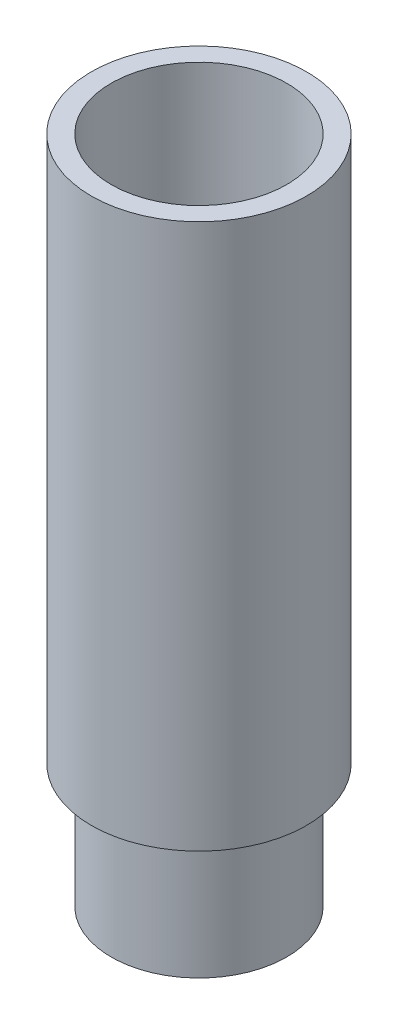
ISO-10303-21;
HEADER;
FILE_DESCRIPTION(('STEP AP214'),'2;1');
FILE_NAME('part.step','',(''),(''),'','','');
FILE_SCHEMA(('AUTOMOTIVE_DESIGN { 1 0 10303 214 1 1 1 1 }'));
ENDSEC;
DATA;
#1=APPLICATION_CONTEXT('core data for automotive mechanical design processes');
#2=APPLICATION_PROTOCOL_DEFINITION('international standard','automotive_design',2000,#1);
#3=PRODUCT_CONTEXT('',#1,'mechanical');
#4=PRODUCT('Part','Part','',(#3));
#5=PRODUCT_RELATED_PRODUCT_CATEGORY('part','',(#4));
#6=PRODUCT_DEFINITION_FORMATION('','',#4);
#7=PRODUCT_DEFINITION_CONTEXT('part definition',#1,'design');
#8=PRODUCT_DEFINITION('design','',#6,#7);
#9=PRODUCT_DEFINITION_SHAPE('','',#8);
#10=(LENGTH_UNIT() NAMED_UNIT(*) SI_UNIT(.MILLI.,.METRE.));
#11=(NAMED_UNIT(*) PLANE_ANGLE_UNIT() SI_UNIT($,.RADIAN.));
#12=(NAMED_UNIT(*) SI_UNIT($,.STERADIAN.) SOLID_ANGLE_UNIT());
#13=UNCERTAINTY_MEASURE_WITH_UNIT(LENGTH_MEASURE(1.E-05),#10,'distance_accuracy_value','');
#14=(GEOMETRIC_REPRESENTATION_CONTEXT(3) GLOBAL_UNCERTAINTY_ASSIGNED_CONTEXT((#13)) GLOBAL_UNIT_ASSIGNED_CONTEXT((#10,
#11,#12)) REPRESENTATION_CONTEXT('',''));
#15=CARTESIAN_POINT('',(0.,0.,0.));
#16=DIRECTION('',(0.,0.,1.));
#17=DIRECTION('',(1.,0.,0.));
#18=AXIS2_PLACEMENT_3D('',#15,#16,#17);
#19=CARTESIAN_POINT('',(0.,19.05,0.));
#20=DIRECTION('',(0.,-1.,0.));
#21=DIRECTION('',(0.,0.,-1.));
#22=AXIS2_PLACEMENT_3D('',#19,#20,#21);
#23=CYLINDRICAL_SURFACE('',#22,6.9723);
#24=CARTESIAN_POINT('',(0.,19.05,0.));
#25=DIRECTION('',(0.,1.,0.));
#26=DIRECTION('',(0.,0.,1.));
#27=AXIS2_PLACEMENT_3D('',#24,#25,#26);
#28=CIRCLE('',#27,6.9723);
#29=CARTESIAN_POINT('',(0.,19.05,6.9723));
#30=VERTEX_POINT('',#29);
#31=EDGE_CURVE('E97',#30,#30,#28,.T.);
#32=ORIENTED_EDGE('',*,*,#31,.T.);
#33=EDGE_LOOP('',(#32));
#34=FACE_BOUND('',#33,.T.);
#35=CARTESIAN_POINT('',(0.,0.,0.));
#36=DIRECTION('',(0.,1.,0.));
#37=DIRECTION('',(0.,0.,1.));
#38=AXIS2_PLACEMENT_3D('',#35,#36,#37);
#39=CIRCLE('',#38,6.9723);
#40=CARTESIAN_POINT('',(2.54,0.,6.49317851980061));
#41=VERTEX_POINT('',#40);
#42=CARTESIAN_POINT('',(2.54,0.,-6.49317851980061));
#43=VERTEX_POINT('',#42);
#44=EDGE_CURVE('E93',#41,#43,#39,.T.);
#45=ORIENTED_EDGE('',*,*,#44,.F.);
#46=DIRECTION('',(0.,-1.,0.));
#47=VECTOR('',#46,1.);
#48=CARTESIAN_POINT('',(2.54,19.05,6.49317851980061));
#49=LINE('',#48,#47);
#50=CARTESIAN_POINT('',(2.54,2.54,6.49317851980061));
#51=VERTEX_POINT('',#50);
#52=EDGE_CURVE('E155',#51,#41,#49,.T.);
#53=ORIENTED_EDGE('',*,*,#52,.F.);
#54=CARTESIAN_POINT('',(0.,2.54,0.));
#55=DIRECTION('',(0.,-1.,0.));
#56=DIRECTION('',(0.,0.,-1.));
#57=AXIS2_PLACEMENT_3D('',#54,#55,#56);
#58=CIRCLE('',#57,6.9723);
#59=CARTESIAN_POINT('',(0.,2.54,6.9723));
#60=VERTEX_POINT('',#59);
#61=EDGE_CURVE('E81',#60,#51,#58,.F.);
#62=ORIENTED_EDGE('',*,*,#61,.F.);
#63=DIRECTION('',(0.,-1.,0.));
#64=VECTOR('',#63,1.);
#65=CARTESIAN_POINT('',(0.,19.05,6.9723));
#66=LINE('',#65,#64);
#67=CARTESIAN_POINT('',(0.,0.,6.9723));
#68=VERTEX_POINT('',#67);
#69=EDGE_CURVE('E92',#68,#60,#66,.F.);
#70=ORIENTED_EDGE('',*,*,#69,.F.);
#71=CARTESIAN_POINT('',(0.,0.,-6.9723));
#72=VERTEX_POINT('',#71);
#73=EDGE_CURVE('E80',#72,#68,#39,.T.);
#74=ORIENTED_EDGE('',*,*,#73,.F.);
#75=DIRECTION('',(0.,-1.,0.));
#76=VECTOR('',#75,1.);
#77=CARTESIAN_POINT('',(0.,19.05,-6.9723));
#78=LINE('',#77,#76);
#79=CARTESIAN_POINT('',(0.,2.54,-6.9723));
#80=VERTEX_POINT('',#79);
#81=EDGE_CURVE('E85',#72,#80,#78,.F.);
#82=ORIENTED_EDGE('',*,*,#81,.T.);
#83=CARTESIAN_POINT('',(0.,2.54,0.));
#84=DIRECTION('',(0.,1.,0.));
#85=DIRECTION('',(0.,0.,1.));
#86=AXIS2_PLACEMENT_3D('',#83,#84,#85);
#87=CIRCLE('',#86,6.9723);
#88=CARTESIAN_POINT('',(2.54,2.54,-6.49317851980061));
#89=VERTEX_POINT('',#88);
#90=EDGE_CURVE('E52',#80,#89,#87,.F.);
#91=ORIENTED_EDGE('',*,*,#90,.T.);
#92=DIRECTION('',(0.,-1.,0.));
#93=VECTOR('',#92,1.);
#94=CARTESIAN_POINT('',(2.54,19.05,-6.49317851980061));
#95=LINE('',#94,#93);
#96=EDGE_CURVE('E152',#89,#43,#95,.T.);
#97=ORIENTED_EDGE('',*,*,#96,.T.);
#98=EDGE_LOOP('',(#45,#53,#62,#70,#74,#82,#91,#97));
#99=FACE_BOUND('',#98,.T.);
#100=ADVANCED_FACE('F37',(#34,#99),#23,.F.);
#101=CARTESIAN_POINT('',(0.,19.05,0.));
#102=DIRECTION('',(0.,-1.,0.));
#103=DIRECTION('',(0.,0.,-1.));
#104=AXIS2_PLACEMENT_3D('',#101,#102,#103);
#105=CYLINDRICAL_SURFACE('',#104,9.0043);
#106=CARTESIAN_POINT('',(0.,0.,0.));
#107=DIRECTION('',(0.,1.,0.));
#108=DIRECTION('',(0.,0.,1.));
#109=AXIS2_PLACEMENT_3D('',#106,#107,#108);
#110=CIRCLE('',#109,9.0043);
#111=CARTESIAN_POINT('',(0.,0.,-9.0043));
#112=VERTEX_POINT('',#111);
#113=EDGE_CURVE('E45',#112,#112,#110,.T.);
#114=CARTESIAN_POINT('',(0.,12.7,0.));
#115=DIRECTION('',(0.,1.,0.));
#116=DIRECTION('',(0.,0.,1.));
#117=AXIS2_PLACEMENT_3D('',#114,#115,#116);
#118=CIRCLE('',#117,9.0043);
#119=CARTESIAN_POINT('',(0.,12.7,-9.0043));
#120=VERTEX_POINT('',#119);
#121=EDGE_CURVE('E11',#120,#120,#118,.T.);
#122=CARTESIAN_POINT('',(0.,0.,-9.0043));
#123=CARTESIAN_POINT('',(0.,0.132291666666667,-9.0043));
#124=CARTESIAN_POINT('',(0.,0.264583333333334,-9.0043));
#125=CARTESIAN_POINT('',(0.,0.529166666666667,-9.0043));
#126=CARTESIAN_POINT('',(0.,0.661458333333333,-9.0043));
#127=CARTESIAN_POINT('',(0.,0.926041666666666,-9.0043));
#128=CARTESIAN_POINT('',(0.,1.05833333333333,-9.0043));
#129=CARTESIAN_POINT('',(0.,1.32291666666667,-9.0043));
#130=CARTESIAN_POINT('',(0.,1.45520833333333,-9.0043));
#131=CARTESIAN_POINT('',(0.,1.71979166666667,-9.0043));
#132=CARTESIAN_POINT('',(0.,1.85208333333333,-9.0043));
#133=CARTESIAN_POINT('',(0.,2.11666666666667,-9.0043));
#134=CARTESIAN_POINT('',(0.,2.24895833333333,-9.0043));
#135=CARTESIAN_POINT('',(0.,2.51354166666667,-9.0043));
#136=CARTESIAN_POINT('',(0.,2.64583333333333,-9.0043));
#137=CARTESIAN_POINT('',(0.,2.91041666666667,-9.0043));
#138=CARTESIAN_POINT('',(0.,3.04270833333333,-9.0043));
#139=CARTESIAN_POINT('',(0.,3.30729166666667,-9.0043));
#140=CARTESIAN_POINT('',(0.,3.43958333333333,-9.0043));
#141=CARTESIAN_POINT('',(0.,3.70416666666667,-9.0043));
#142=CARTESIAN_POINT('',(0.,3.83645833333333,-9.0043));
#143=CARTESIAN_POINT('',(0.,4.10104166666667,-9.0043));
#144=CARTESIAN_POINT('',(0.,4.23333333333333,-9.0043));
#145=CARTESIAN_POINT('',(0.,4.49791666666667,-9.0043));
#146=CARTESIAN_POINT('',(0.,4.63020833333333,-9.0043));
#147=CARTESIAN_POINT('',(0.,4.89479166666667,-9.0043));
#148=CARTESIAN_POINT('',(0.,5.02708333333333,-9.0043));
#149=CARTESIAN_POINT('',(0.,5.29166666666667,-9.0043));
#150=CARTESIAN_POINT('',(0.,5.42395833333333,-9.0043));
#151=CARTESIAN_POINT('',(0.,5.68854166666667,-9.0043));
#152=CARTESIAN_POINT('',(0.,5.82083333333333,-9.0043));
#153=CARTESIAN_POINT('',(0.,6.08541666666667,-9.0043));
#154=CARTESIAN_POINT('',(0.,6.21770833333333,-9.0043));
#155=CARTESIAN_POINT('',(0.,6.48229166666667,-9.0043));
#156=CARTESIAN_POINT('',(0.,6.61458333333333,-9.0043));
#157=CARTESIAN_POINT('',(0.,6.87916666666667,-9.0043));
#158=CARTESIAN_POINT('',(0.,7.01145833333333,-9.0043));
#159=CARTESIAN_POINT('',(0.,7.27604166666667,-9.0043));
#160=CARTESIAN_POINT('',(0.,7.40833333333333,-9.0043));
#161=CARTESIAN_POINT('',(0.,7.67291666666667,-9.0043));
#162=CARTESIAN_POINT('',(0.,7.80520833333333,-9.0043));
#163=CARTESIAN_POINT('',(0.,8.06979166666667,-9.0043));
#164=CARTESIAN_POINT('',(0.,8.20208333333333,-9.0043));
#165=CARTESIAN_POINT('',(0.,8.46666666666667,-9.0043));
#166=CARTESIAN_POINT('',(0.,8.59895833333333,-9.0043));
#167=CARTESIAN_POINT('',(0.,8.86354166666667,-9.0043));
#168=CARTESIAN_POINT('',(0.,8.99583333333334,-9.0043));
#169=CARTESIAN_POINT('',(0.,9.26041666666667,-9.0043));
#170=CARTESIAN_POINT('',(0.,9.39270833333333,-9.0043));
#171=CARTESIAN_POINT('',(0.,9.65729166666667,-9.0043));
#172=CARTESIAN_POINT('',(0.,9.78958333333333,-9.0043));
#173=CARTESIAN_POINT('',(0.,10.0541666666667,-9.0043));
#174=CARTESIAN_POINT('',(0.,10.1864583333333,-9.0043));
#175=CARTESIAN_POINT('',(0.,10.4510416666667,-9.0043));
#176=CARTESIAN_POINT('',(0.,10.5833333333333,-9.0043));
#177=CARTESIAN_POINT('',(0.,10.8479166666667,-9.0043));
#178=CARTESIAN_POINT('',(0.,10.9802083333333,-9.0043));
#179=CARTESIAN_POINT('',(0.,11.2447916666667,-9.0043));
#180=CARTESIAN_POINT('',(0.,11.3770833333333,-9.0043));
#181=CARTESIAN_POINT('',(0.,11.6416666666667,-9.0043));
#182=CARTESIAN_POINT('',(0.,11.7739583333333,-9.0043));
#183=CARTESIAN_POINT('',(0.,12.0385416666667,-9.0043));
#184=CARTESIAN_POINT('',(0.,12.1708333333333,-9.0043));
#185=CARTESIAN_POINT('',(0.,12.4354166666667,-9.0043));
#186=CARTESIAN_POINT('',(0.,12.5677083333333,-9.0043));
#187=CARTESIAN_POINT('',(0.,12.7,-9.0043));
#188=B_SPLINE_CURVE_WITH_KNOTS('',3,(#122,#123,#124,#125,#126,#127,#128,#129,#130,#131,#132,
#133,#134,#135,#136,#137,#138,#139,#140,#141,#142,#143,#144,#145,#146,#147,#148,#149,#150,#151,
#152,#153,#154,#155,#156,#157,#158,#159,#160,#161,#162,#163,#164,#165,#166,#167,#168,#169,#170,
#171,#172,#173,#174,#175,#176,#177,#178,#179,#180,#181,#182,#183,#184,#185,#186,#187),
.UNSPECIFIED.,.F.,.F.,(4,2,2,2,2,2,2,2,2,2,2,2,2,2,2,2,2,2,2,2,2,2,2,2,2,2,2,2,2,2,2,2,4),(0.,
0.396875000000001,0.793749999999999,1.190625,1.5875,1.984375,2.38125,2.778125,3.175,3.571875,
3.96875,4.365625,4.7625,5.159375,5.55625,5.953125,6.35,6.746875,7.14375,7.540625,7.9375,
8.334375,8.73125,9.128125,9.525,9.921875,10.31875,10.715625,11.1125,11.509375,11.90625,
12.303125,12.7),.UNSPECIFIED.);
#189=EDGE_CURVE('BSEAM39',#112,#120,#188,.T.);
#190=ORIENTED_EDGE('',*,*,#113,.T.);
#191=ORIENTED_EDGE('',*,*,#121,.F.);
#192=ORIENTED_EDGE('',*,*,#189,.T.);
#193=ORIENTED_EDGE('',*,*,#189,.F.);
#194=EDGE_LOOP('',(#190,#192,#191,#193));
#195=FACE_BOUND('',#194,.T.);
#196=ADVANCED_FACE('F39',(#195),#105,.T.);
#197=CARTESIAN_POINT('',(0.,19.05,0.));
#198=DIRECTION('',(0.,1.,0.));
#199=DIRECTION('',(0.,0.,1.));
#200=AXIS2_PLACEMENT_3D('',#197,#198,#199);
#201=PLANE('',#200);
#202=CARTESIAN_POINT('',(0.,19.05,0.));
#203=DIRECTION('',(0.,1.,0.));
#204=DIRECTION('',(0.,0.,1.));
#205=AXIS2_PLACEMENT_3D('',#202,#203,#204);
#206=CIRCLE('',#205,9.0043);
#207=CARTESIAN_POINT('',(0.,19.05,9.0043));
#208=VERTEX_POINT('',#207);
#209=EDGE_CURVE('E94',#208,#208,#206,.T.);
#210=ORIENTED_EDGE('',*,*,#209,.T.);
#211=EDGE_LOOP('',(#210));
#212=FACE_BOUND('',#211,.T.);
#213=ORIENTED_EDGE('',*,*,#31,.F.);
#214=EDGE_LOOP('',(#213));
#215=FACE_BOUND('',#214,.T.);
#216=ADVANCED_FACE('F109',(#212,#215),#201,.T.);
#217=CARTESIAN_POINT('',(0.,0.,0.));
#218=DIRECTION('',(0.,1.,0.));
#219=DIRECTION('',(0.,0.,1.));
#220=AXIS2_PLACEMENT_3D('',#217,#218,#219);
#221=PLANE('',#220);
#222=DIRECTION('',(0.,0.,-1.));
#223=VECTOR('',#222,1.);
#224=CARTESIAN_POINT('',(2.54,0.,11.0373));
#225=LINE('',#224,#223);
#226=EDGE_CURVE('E82',#41,#43,#225,.T.);
#227=ORIENTED_EDGE('',*,*,#226,.F.);
#228=ORIENTED_EDGE('',*,*,#44,.T.);
#229=EDGE_LOOP('',(#227,#228));
#230=FACE_BOUND('',#229,.T.);
#231=ORIENTED_EDGE('',*,*,#113,.F.);
#232=EDGE_LOOP('',(#231));
#233=FACE_BOUND('',#232,.T.);
#234=ORIENTED_EDGE('',*,*,#73,.T.);
#235=DIRECTION('',(0.,0.,-1.));
#236=VECTOR('',#235,1.);
#237=CARTESIAN_POINT('',(0.,0.,11.0373));
#238=LINE('',#237,#236);
#239=EDGE_CURVE('E60',#68,#72,#238,.T.);
#240=ORIENTED_EDGE('',*,*,#239,.T.);
#241=EDGE_LOOP('',(#234,#240));
#242=FACE_BOUND('',#241,.T.);
#243=ADVANCED_FACE('F78',(#230,#233,#242),#221,.F.);
#244=CARTESIAN_POINT('',(0.,12.7,0.));
#245=DIRECTION('',(0.,1.,0.));
#246=DIRECTION('',(0.,0.,1.));
#247=AXIS2_PLACEMENT_3D('',#244,#245,#246);
#248=CYLINDRICAL_SURFACE('',#247,11.0363);
#249=CARTESIAN_POINT('',(0.,12.7,0.));
#250=DIRECTION('',(0.,1.,0.));
#251=DIRECTION('',(0.,0.,1.));
#252=AXIS2_PLACEMENT_3D('',#249,#250,#251);
#253=CIRCLE('',#252,11.0363);
#254=CARTESIAN_POINT('',(0.,12.7,11.0363));
#255=VERTEX_POINT('',#254);
#256=EDGE_CURVE('E99',#255,#255,#253,.T.);
#257=ORIENTED_EDGE('',*,*,#256,.T.);
#258=EDGE_LOOP('',(#257));
#259=FACE_BOUND('',#258,.T.);
#260=CARTESIAN_POINT('',(0.,68.58,0.));
#261=DIRECTION('',(0.,1.,0.));
#262=DIRECTION('',(0.,0.,1.));
#263=AXIS2_PLACEMENT_3D('',#260,#261,#262);
#264=CIRCLE('',#263,11.0363);
#265=CARTESIAN_POINT('',(0.,68.58,11.0363));
#266=VERTEX_POINT('',#265);
#267=EDGE_CURVE('E163',#266,#266,#264,.T.);
#268=ORIENTED_EDGE('',*,*,#267,.F.);
#269=EDGE_LOOP('',(#268));
#270=FACE_BOUND('',#269,.T.);
#271=ADVANCED_FACE('F117',(#259,#270),#248,.T.);
#272=CARTESIAN_POINT('',(0.,12.7,0.));
#273=DIRECTION('',(0.,1.,0.));
#274=DIRECTION('',(0.,0.,1.));
#275=AXIS2_PLACEMENT_3D('',#272,#273,#274);
#276=PLANE('',#275);
#277=ORIENTED_EDGE('',*,*,#121,.T.);
#278=EDGE_LOOP('',(#277));
#279=FACE_BOUND('',#278,.T.);
#280=ORIENTED_EDGE('',*,*,#256,.F.);
#281=EDGE_LOOP('',(#280));
#282=FACE_BOUND('',#281,.T.);
#283=ADVANCED_FACE('F126',(#279,#282),#276,.F.);
#284=CARTESIAN_POINT('',(0.,12.7,0.));
#285=DIRECTION('',(0.,1.,0.));
#286=DIRECTION('',(0.,0.,1.));
#287=AXIS2_PLACEMENT_3D('',#284,#285,#286);
#288=CYLINDRICAL_SURFACE('',#287,9.0043);
#289=ORIENTED_EDGE('',*,*,#209,.F.);
#290=EDGE_LOOP('',(#289));
#291=FACE_BOUND('',#290,.T.);
#292=CARTESIAN_POINT('',(0.,68.58,0.));
#293=DIRECTION('',(0.,1.,0.));
#294=DIRECTION('',(0.,0.,1.));
#295=AXIS2_PLACEMENT_3D('',#292,#293,#294);
#296=CIRCLE('',#295,9.0043);
#297=CARTESIAN_POINT('',(0.,68.58,9.0043));
#298=VERTEX_POINT('',#297);
#299=EDGE_CURVE('E160',#298,#298,#296,.T.);
#300=ORIENTED_EDGE('',*,*,#299,.T.);
#301=EDGE_LOOP('',(#300));
#302=FACE_BOUND('',#301,.T.);
#303=ADVANCED_FACE('F130',(#291,#302),#288,.F.);
#304=CARTESIAN_POINT('',(0.,68.58,0.));
#305=DIRECTION('',(0.,1.,0.));
#306=DIRECTION('',(0.,0.,1.));
#307=AXIS2_PLACEMENT_3D('',#304,#305,#306);
#308=PLANE('',#307);
#309=ORIENTED_EDGE('',*,*,#267,.T.);
#310=EDGE_LOOP('',(#309));
#311=FACE_BOUND('',#310,.T.);
#312=ORIENTED_EDGE('',*,*,#299,.F.);
#313=EDGE_LOOP('',(#312));
#314=FACE_BOUND('',#313,.T.);
#315=ADVANCED_FACE('F134',(#311,#314),#308,.T.);
#316=CARTESIAN_POINT('',(0.,2.54,11.0373));
#317=DIRECTION('',(0.,-1.,0.));
#318=DIRECTION('',(0.,0.,-1.));
#319=AXIS2_PLACEMENT_3D('',#316,#317,#318);
#320=PLANE('',#319);
#321=DIRECTION('',(0.,0.,-1.));
#322=VECTOR('',#321,1.);
#323=CARTESIAN_POINT('',(0.,2.54,11.0373));
#324=LINE('',#323,#322);
#325=EDGE_CURVE('E87',#60,#80,#324,.T.);
#326=ORIENTED_EDGE('',*,*,#325,.F.);
#327=ORIENTED_EDGE('',*,*,#61,.T.);
#328=DIRECTION('',(0.,0.,-1.));
#329=VECTOR('',#328,1.);
#330=CARTESIAN_POINT('',(2.54,2.54,11.0373));
#331=LINE('',#330,#329);
#332=EDGE_CURVE('E151',#51,#89,#331,.T.);
#333=ORIENTED_EDGE('',*,*,#332,.T.);
#334=ORIENTED_EDGE('',*,*,#90,.F.);
#335=EDGE_LOOP('',(#326,#327,#333,#334));
#336=FACE_BOUND('',#335,.T.);
#337=ADVANCED_FACE('F138',(#336),#320,.F.);
#338=CARTESIAN_POINT('',(2.54,0.,11.0373));
#339=DIRECTION('',(-1.,0.,0.));
#340=DIRECTION('',(0.,-1.,0.));
#341=AXIS2_PLACEMENT_3D('',#338,#339,#340);
#342=PLANE('',#341);
#343=ORIENTED_EDGE('',*,*,#332,.F.);
#344=ORIENTED_EDGE('',*,*,#52,.T.);
#345=ORIENTED_EDGE('',*,*,#226,.T.);
#346=ORIENTED_EDGE('',*,*,#96,.F.);
#347=EDGE_LOOP('',(#343,#344,#345,#346));
#348=FACE_BOUND('',#347,.T.);
#349=ADVANCED_FACE('F142',(#348),#342,.F.);
#350=CARTESIAN_POINT('',(0.,0.,11.0373));
#351=DIRECTION('',(1.,0.,0.));
#352=DIRECTION('',(0.,1.,0.));
#353=AXIS2_PLACEMENT_3D('',#350,#351,#352);
#354=PLANE('',#353);
#355=ORIENTED_EDGE('',*,*,#239,.F.);
#356=ORIENTED_EDGE('',*,*,#69,.T.);
#357=ORIENTED_EDGE('',*,*,#325,.T.);
#358=ORIENTED_EDGE('',*,*,#81,.F.);
#359=EDGE_LOOP('',(#355,#356,#357,#358));
#360=FACE_BOUND('',#359,.T.);
#361=ADVANCED_FACE('F86',(#360),#354,.F.);
#362=CLOSED_SHELL('',(#100,#196,#216,#243,#271,#283,#303,#315,#337,#349,#361));
#363=MANIFOLD_SOLID_BREP('B2',#362);
#364=ADVANCED_BREP_SHAPE_REPRESENTATION('',(#18,#363),#14);
#365=SHAPE_DEFINITION_REPRESENTATION(#9,#364);
ENDSEC;
END-ISO-10303-21;
